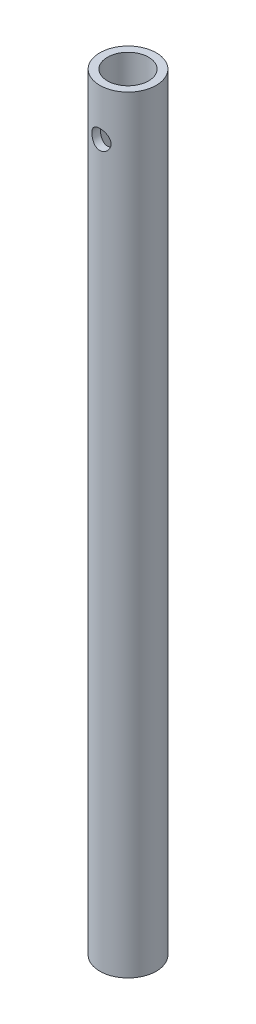
ISO-10303-21;
HEADER;
FILE_DESCRIPTION(('STEP AP214'),'2;1');
FILE_NAME('part.step','',(''),(''),'','','');
FILE_SCHEMA(('AUTOMOTIVE_DESIGN { 1 0 10303 214 1 1 1 1 }'));
ENDSEC;
DATA;
#1=APPLICATION_CONTEXT('core data for automotive mechanical design processes');
#2=APPLICATION_PROTOCOL_DEFINITION('international standard','automotive_design',2000,#1);
#3=PRODUCT_CONTEXT('',#1,'mechanical');
#4=PRODUCT('Part','Part','',(#3));
#5=PRODUCT_RELATED_PRODUCT_CATEGORY('part','',(#4));
#6=PRODUCT_DEFINITION_FORMATION('','',#4);
#7=PRODUCT_DEFINITION_CONTEXT('part definition',#1,'design');
#8=PRODUCT_DEFINITION('design','',#6,#7);
#9=PRODUCT_DEFINITION_SHAPE('','',#8);
#10=(LENGTH_UNIT() NAMED_UNIT(*) SI_UNIT(.MILLI.,.METRE.));
#11=(NAMED_UNIT(*) PLANE_ANGLE_UNIT() SI_UNIT($,.RADIAN.));
#12=(NAMED_UNIT(*) SI_UNIT($,.STERADIAN.) SOLID_ANGLE_UNIT());
#13=UNCERTAINTY_MEASURE_WITH_UNIT(LENGTH_MEASURE(1.E-05),#10,'distance_accuracy_value','');
#14=(GEOMETRIC_REPRESENTATION_CONTEXT(3) GLOBAL_UNCERTAINTY_ASSIGNED_CONTEXT((#13)) GLOBAL_UNIT_ASSIGNED_CONTEXT((#10,
#11,#12)) REPRESENTATION_CONTEXT('',''));
#15=CARTESIAN_POINT('',(0.,0.,0.));
#16=DIRECTION('',(0.,0.,1.));
#17=DIRECTION('',(1.,0.,0.));
#18=AXIS2_PLACEMENT_3D('',#15,#16,#17);
#19=CARTESIAN_POINT('',(0.,177.8,0.));
#20=DIRECTION('',(0.,-1.,0.));
#21=DIRECTION('',(0.,0.,-1.));
#22=AXIS2_PLACEMENT_3D('',#19,#20,#21);
#23=CYLINDRICAL_SURFACE('',#22,6.5405);
#24=CARTESIAN_POINT('',(0.,164.719,6.5405));
#25=CARTESIAN_POINT('',(0.121132576262376,164.718998951863,6.5405006945255));
#26=CARTESIAN_POINT('',(0.242257931020928,164.728935159981,6.53710408727894));
#27=CARTESIAN_POINT('',(0.480932900270719,164.768290105498,6.52388959711018));
#28=CARTESIAN_POINT('',(0.598482280736796,164.797710115133,6.51407129487021));
#29=CARTESIAN_POINT('',(0.826530001579762,164.874902133475,6.48907836143574));
#30=CARTESIAN_POINT('',(0.937040029700405,164.922642745856,6.47391289735371));
#31=CARTESIAN_POINT('',(1.14848359009996,165.034976223633,6.4397679194841));
#32=CARTESIAN_POINT('',(1.24941511344602,165.099572613643,6.42078760818663));
#33=CARTESIAN_POINT('',(1.4424522525712,165.246212390509,6.38024443891928));
#34=CARTESIAN_POINT('',(1.53416760658787,165.328751822334,6.35861797690676));
#35=CARTESIAN_POINT('',(1.70275505636462,165.507880393515,6.31556415375625));
#36=CARTESIAN_POINT('',(1.7796237094821,165.604472782378,6.29413683989038));
#37=CARTESIAN_POINT('',(1.91860029157389,165.812522841046,6.25320175077674));
#38=CARTESIAN_POINT('',(1.98019445121455,165.924340361728,6.23377113849206));
#39=CARTESIAN_POINT('',(2.08353522083276,166.157513847158,6.19999989694451));
#40=CARTESIAN_POINT('',(2.12528815975622,166.278866755899,6.1856576449686));
#41=CARTESIAN_POINT('',(2.18628570483226,166.523218871702,6.16435824012625));
#42=CARTESIAN_POINT('',(2.20626378011438,166.646013441285,6.15716121256191));
#43=CARTESIAN_POINT('',(2.22543766663131,166.893406446025,6.15025863403572));
#44=CARTESIAN_POINT('',(2.22464020114657,167.018004284571,6.1505506595021));
#45=CARTESIAN_POINT('',(2.20285382169742,167.259147562174,6.15838347708188));
#46=CARTESIAN_POINT('',(2.18283053398198,167.375793475745,6.16557759455485));
#47=CARTESIAN_POINT('',(2.12473928148989,167.603959589453,6.18583541439312));
#48=CARTESIAN_POINT('',(2.08666907662711,167.715479151392,6.19889984540467));
#49=CARTESIAN_POINT('',(1.99294818062452,167.932386834782,6.22966741809598));
#50=CARTESIAN_POINT('',(1.93701679186721,168.03764283422,6.2474437953798));
#51=CARTESIAN_POINT('',(1.8093561272359,168.237576837177,6.28560256000648));
#52=CARTESIAN_POINT('',(1.73762214634244,168.33225167761,6.30598572272657));
#53=CARTESIAN_POINT('',(1.5757875267895,168.513750574643,6.34841649147213));
#54=CARTESIAN_POINT('',(1.4849001028631,168.599867499244,6.37049432598464));
#55=CARTESIAN_POINT('',(1.28970379022984,168.755825725989,6.41285946846446));
#56=CARTESIAN_POINT('',(1.18539351301385,168.825665342243,6.4331465908274));
#57=CARTESIAN_POINT('',(0.964768051606887,168.947685782435,6.46992929341151));
#58=CARTESIAN_POINT('',(0.848336721616711,168.999670374811,6.48638213885732));
#59=CARTESIAN_POINT('',(0.607687892371148,169.083093586847,6.51333144827482));
#60=CARTESIAN_POINT('',(0.483473226398697,169.114539635856,6.52383006587157));
#61=CARTESIAN_POINT('',(0.236764959115406,169.154724666116,6.53732798446892));
#62=CARTESIAN_POINT('',(0.114443956022652,169.164418651597,6.54064246105451));
#63=CARTESIAN_POINT('',(-0.130105529757352,169.16355375745,6.54034816344002));
#64=CARTESIAN_POINT('',(-0.252334024955951,169.152998448899,6.53674060997882));
#65=CARTESIAN_POINT('',(-0.489361657961048,169.112686309754,6.52321577408566));
#66=CARTESIAN_POINT('',(-0.604273689019556,169.083521473034,6.51349315203944));
#67=CARTESIAN_POINT('',(-0.827522674029989,169.007564098365,6.48891124788637));
#68=CARTESIAN_POINT('',(-0.935858781739522,168.96076929721,6.47405130630871));
#69=CARTESIAN_POINT('',(-1.14612618946117,168.849491026101,6.44020082239815));
#70=CARTESIAN_POINT('',(-1.24780734719528,168.784566262349,6.4211100668744));
#71=CARTESIAN_POINT('',(-1.43913892417322,168.639386256454,6.38095542059471));
#72=CARTESIAN_POINT('',(-1.52878552806194,168.559126171955,6.35989090766877));
#73=CARTESIAN_POINT('',(-1.69792092079088,168.381065727657,6.31689668144283));
#74=CARTESIAN_POINT('',(-1.77672843460498,168.282615147222,6.29497318640828));
#75=CARTESIAN_POINT('',(-1.91679571661435,168.073420304258,6.25374947150999));
#76=CARTESIAN_POINT('',(-1.97805517100834,167.962675821933,6.23444929856076));
#77=CARTESIAN_POINT('',(-2.08104325111369,167.731882911737,6.20083441183624));
#78=CARTESIAN_POINT('',(-2.12279713219411,167.611846750713,6.18651325752495));
#79=CARTESIAN_POINT('',(-2.18529724717974,167.365843997408,6.16471679448302));
#80=CARTESIAN_POINT('',(-2.20605344066258,167.239880246387,6.15723824034612));
#81=CARTESIAN_POINT('',(-2.22517381392396,166.992827363813,6.15035238061075));
#82=CARTESIAN_POINT('',(-2.22467320716479,166.87183655478,6.15053587622403));
#83=CARTESIAN_POINT('',(-2.20410519153714,166.631760103806,6.15793612055697));
#84=CARTESIAN_POINT('',(-2.18403903623686,166.512674340304,6.1651524186837));
#85=CARTESIAN_POINT('',(-2.12572615701712,166.282228844622,6.18549477465294));
#86=CARTESIAN_POINT('',(-2.08786101954629,166.170760707029,6.19849650217168));
#87=CARTESIAN_POINT('',(-1.99533767300426,165.955676330638,6.22889459331582));
#88=CARTESIAN_POINT('',(-1.94067564659561,165.852061883385,6.24629195575329));
#89=CARTESIAN_POINT('',(-1.81324008123762,165.650566450227,6.28449753017933));
#90=CARTESIAN_POINT('',(-1.73976178987064,165.553153774604,6.30542406016515));
#91=CARTESIAN_POINT('',(-1.57795557245076,165.371675083012,6.34784873775207));
#92=CARTESIAN_POINT('',(-1.48962337120322,165.287612923119,6.36934704841694));
#93=CARTESIAN_POINT('',(-1.29625989696614,165.131732378335,6.41155393299936));
#94=CARTESIAN_POINT('',(-1.19069148380667,165.060559251742,6.43219372816793));
#95=CARTESIAN_POINT('',(-0.968401107370004,164.937039329269,6.4693906782087));
#96=CARTESIAN_POINT('',(-0.851681484872829,164.884688593273,6.48594868729819));
#97=CARTESIAN_POINT('',(-0.614188549956153,164.801971730771,6.51265898473805));
#98=CARTESIAN_POINT('',(-0.493661612595488,164.770960349893,6.52299796775736));
#99=CARTESIAN_POINT('',(-0.248753123994206,164.729478142799,6.53691709214358));
#100=CARTESIAN_POINT('',(-0.124372755493418,164.719001076174,6.54049928689662));
#101=CARTESIAN_POINT('',(0.,164.719,6.5405));
#102=B_SPLINE_CURVE_WITH_KNOTS('',3,(#24,#25,#26,#27,#28,#29,#30,#31,#32,#33,#34,#35,#36,#37,
#38,#39,#40,#41,#42,#43,#44,#45,#46,#47,#48,#49,#50,#51,#52,#53,#54,#55,#56,#57,#58,#59,#60,#61,
#62,#63,#64,#65,#66,#67,#68,#69,#70,#71,#72,#73,#74,#75,#76,#77,#78,#79,#80,#81,#82,#83,#84,#85,
#86,#87,#88,#89,#90,#91,#92,#93,#94,#95,#96,#97,#98,#99,#100,#101),.UNSPECIFIED.,.T.,.F.,(4,2,2,
2,2,2,2,2,2,2,2,2,2,2,2,2,2,2,2,2,2,2,2,2,2,2,2,2,2,2,2,2,2,2,2,2,2,2,4),(0.,0.362939878723582,
0.725903458718204,1.08824777976366,1.45066792935401,1.82479151247003,2.19900174322381,
2.58447237758201,2.96981997197505,3.34174285046678,3.71354537056326,4.0676004417078,
4.42169947169597,4.78166248781142,5.14173282350607,5.52138845459631,5.90108339027432,
6.28482691637257,6.66843155500685,7.03483448314207,7.40117280000171,7.75640188898351,
8.11167659518845,8.47649249830628,8.84142378846465,9.22362112384597,9.60582529340308,
9.98753321271865,10.3690599961541,10.730238446787,11.0913937581723,11.4451367958652,
11.7989602863432,12.1687172332681,12.5385807849226,12.9236465107206,13.3086315832049,
13.6813930529482,14.0540412223186),.UNSPECIFIED.);
#103=CARTESIAN_POINT('',(0.,164.719,6.5405));
#104=VERTEX_POINT('',#103);
#105=EDGE_CURVE('E53',#104,#104,#102,.T.);
#106=ORIENTED_EDGE('',*,*,#105,.F.);
#107=EDGE_LOOP('',(#106));
#108=FACE_BOUND('',#107,.T.);
#109=CARTESIAN_POINT('',(0.,169.164,-6.5405));
#110=CARTESIAN_POINT('',(0.121132576262376,169.164001048137,-6.5405006945255));
#111=CARTESIAN_POINT('',(0.242257931020929,169.154064840019,-6.53710408727894));
#112=CARTESIAN_POINT('',(0.48093290027072,169.114709894502,-6.52388959711018));
#113=CARTESIAN_POINT('',(0.598482280736795,169.085289884867,-6.51407129487021));
#114=CARTESIAN_POINT('',(0.82653000157977,169.008097866525,-6.48907836143574));
#115=CARTESIAN_POINT('',(0.937040029700422,168.960357254144,-6.47391289735371));
#116=CARTESIAN_POINT('',(1.14848359009997,168.848023776367,-6.4397679194841));
#117=CARTESIAN_POINT('',(1.24941511344603,168.783427386357,-6.42078760818663));
#118=CARTESIAN_POINT('',(1.4424522525712,168.636787609491,-6.38024443891927));
#119=CARTESIAN_POINT('',(1.53416760658787,168.554248177666,-6.35861797690676));
#120=CARTESIAN_POINT('',(1.70275505636462,168.375119606485,-6.31556415375625));
#121=CARTESIAN_POINT('',(1.7796237094821,168.278527217622,-6.29413683989038));
#122=CARTESIAN_POINT('',(1.91860029157389,168.070477158954,-6.25320175077674));
#123=CARTESIAN_POINT('',(1.98019445121455,167.958659638272,-6.23377113849206));
#124=CARTESIAN_POINT('',(2.08353522083276,167.725486152842,-6.19999989694451));
#125=CARTESIAN_POINT('',(2.12528815975622,167.604133244101,-6.1856576449686));
#126=CARTESIAN_POINT('',(2.18628570483226,167.359781128298,-6.16435824012625));
#127=CARTESIAN_POINT('',(2.20626378011438,167.236986558715,-6.15716121256191));
#128=CARTESIAN_POINT('',(2.22543766663131,166.989593553975,-6.15025863403572));
#129=CARTESIAN_POINT('',(2.22464020114657,166.864995715429,-6.1505506595021));
#130=CARTESIAN_POINT('',(2.20285382169742,166.623852437826,-6.15838347708188));
#131=CARTESIAN_POINT('',(2.18283053398198,166.507206524255,-6.16557759455485));
#132=CARTESIAN_POINT('',(2.12473928148989,166.279040410547,-6.18583541439312));
#133=CARTESIAN_POINT('',(2.08666907662711,166.167520848608,-6.19889984540467));
#134=CARTESIAN_POINT('',(1.99294818062452,165.950613165218,-6.22966741809598));
#135=CARTESIAN_POINT('',(1.93701679186721,165.84535716578,-6.2474437953798));
#136=CARTESIAN_POINT('',(1.8093561272359,165.645423162823,-6.28560256000648));
#137=CARTESIAN_POINT('',(1.73762214634244,165.55074832239,-6.30598572272657));
#138=CARTESIAN_POINT('',(1.5757875267895,165.369249425357,-6.34841649147213));
#139=CARTESIAN_POINT('',(1.48490010286309,165.283132500756,-6.37049432598464));
#140=CARTESIAN_POINT('',(1.28970379022983,165.127174274011,-6.41285946846446));
#141=CARTESIAN_POINT('',(1.18539351301385,165.057334657757,-6.4331465908274));
#142=CARTESIAN_POINT('',(0.964768051606888,164.935314217565,-6.46992929341151));
#143=CARTESIAN_POINT('',(0.848336721616712,164.883329625189,-6.48638213885732));
#144=CARTESIAN_POINT('',(0.607687892371147,164.799906413153,-6.51333144827482));
#145=CARTESIAN_POINT('',(0.483473226398697,164.768460364144,-6.52383006587157));
#146=CARTESIAN_POINT('',(0.236764959115407,164.728275333884,-6.53732798446892));
#147=CARTESIAN_POINT('',(0.114443956022652,164.718581348403,-6.54064246105451));
#148=CARTESIAN_POINT('',(-0.130105529757353,164.71944624255,-6.54034816344002));
#149=CARTESIAN_POINT('',(-0.252334024955953,164.730001551101,-6.53674060997882));
#150=CARTESIAN_POINT('',(-0.489361657961057,164.770313690246,-6.52321577408566));
#151=CARTESIAN_POINT('',(-0.604273689019571,164.799478526966,-6.51349315203944));
#152=CARTESIAN_POINT('',(-0.827522674030003,164.875435901635,-6.48891124788637));
#153=CARTESIAN_POINT('',(-0.935858781739531,164.92223070279,-6.47405130630871));
#154=CARTESIAN_POINT('',(-1.14612618946117,165.033508973899,-6.44020082239815));
#155=CARTESIAN_POINT('',(-1.24780734719528,165.098433737651,-6.4211100668744));
#156=CARTESIAN_POINT('',(-1.43913892417322,165.243613743546,-6.38095542059471));
#157=CARTESIAN_POINT('',(-1.52878552806194,165.323873828045,-6.35989090766877));
#158=CARTESIAN_POINT('',(-1.69792092079088,165.501934272343,-6.31689668144283));
#159=CARTESIAN_POINT('',(-1.77672843460498,165.600384852778,-6.29497318640828));
#160=CARTESIAN_POINT('',(-1.91679571661435,165.809579695742,-6.25374947150999));
#161=CARTESIAN_POINT('',(-1.97805517100834,165.920324178067,-6.23444929856076));
#162=CARTESIAN_POINT('',(-2.08104325111369,166.151117088263,-6.20083441183624));
#163=CARTESIAN_POINT('',(-2.12279713219411,166.271153249287,-6.18651325752495));
#164=CARTESIAN_POINT('',(-2.18529724717974,166.517156002592,-6.16471679448302));
#165=CARTESIAN_POINT('',(-2.20605344066258,166.643119753613,-6.15723824034612));
#166=CARTESIAN_POINT('',(-2.22517381392396,166.890172636187,-6.15035238061075));
#167=CARTESIAN_POINT('',(-2.22467320716479,167.01116344522,-6.15053587622403));
#168=CARTESIAN_POINT('',(-2.20410519153714,167.251239896194,-6.15793612055697));
#169=CARTESIAN_POINT('',(-2.18403903623686,167.370325659696,-6.1651524186837));
#170=CARTESIAN_POINT('',(-2.12572615701712,167.600771155378,-6.18549477465294));
#171=CARTESIAN_POINT('',(-2.0878610195463,167.712239292971,-6.19849650217168));
#172=CARTESIAN_POINT('',(-1.99533767300427,167.927323669362,-6.22889459331582));
#173=CARTESIAN_POINT('',(-1.94067564659562,168.030938116615,-6.24629195575329));
#174=CARTESIAN_POINT('',(-1.81324008123762,168.232433549773,-6.28449753017933));
#175=CARTESIAN_POINT('',(-1.73976178987064,168.329846225396,-6.30542406016515));
#176=CARTESIAN_POINT('',(-1.57795557245076,168.511324916988,-6.34784873775207));
#177=CARTESIAN_POINT('',(-1.48962337120321,168.595387076881,-6.36934704841694));
#178=CARTESIAN_POINT('',(-1.29625989696614,168.751267621665,-6.41155393299936));
#179=CARTESIAN_POINT('',(-1.19069148380669,168.822440748258,-6.43219372816792));
#180=CARTESIAN_POINT('',(-0.968401107370035,168.945960670731,-6.4693906782087));
#181=CARTESIAN_POINT('',(-0.851681484872857,168.998311406727,-6.48594868729819));
#182=CARTESIAN_POINT('',(-0.614188549956175,169.081028269229,-6.51265898473804));
#183=CARTESIAN_POINT('',(-0.493661612595508,169.112039650107,-6.52299796775736));
#184=CARTESIAN_POINT('',(-0.248753123994219,169.153521857201,-6.53691709214358));
#185=CARTESIAN_POINT('',(-0.124372755493425,169.163998923826,-6.54049928689662));
#186=CARTESIAN_POINT('',(0.,169.164,-6.5405));
#187=B_SPLINE_CURVE_WITH_KNOTS('',3,(#109,#110,#111,#112,#113,#114,#115,#116,#117,#118,#119,
#120,#121,#122,#123,#124,#125,#126,#127,#128,#129,#130,#131,#132,#133,#134,#135,#136,#137,#138,
#139,#140,#141,#142,#143,#144,#145,#146,#147,#148,#149,#150,#151,#152,#153,#154,#155,#156,#157,
#158,#159,#160,#161,#162,#163,#164,#165,#166,#167,#168,#169,#170,#171,#172,#173,#174,#175,#176,
#177,#178,#179,#180,#181,#182,#183,#184,#185,#186),.UNSPECIFIED.,.T.,.F.,(4,2,2,2,2,2,2,2,2,2,2,
2,2,2,2,2,2,2,2,2,2,2,2,2,2,2,2,2,2,2,2,2,2,2,2,2,2,2,4),(0.,0.362939878723583,
0.725903458718204,1.08824777976368,1.45066792935401,1.82479151247004,2.19900174322382,
2.58447237758201,2.96981997197505,3.34174285046678,3.71354537056327,4.0676004417078,
4.42169947169598,4.78166248781143,5.14173282350607,5.52138845459632,5.90108339027432,
6.28482691637258,6.66843155500685,7.03483448314207,7.40117280000172,7.75640188898354,
8.11167659518845,8.47649249830628,8.84142378846466,9.22362112384597,9.60582529340308,
9.98753321271865,10.3690599961541,10.730238446787,11.0913937581723,11.4451367958652,
11.7989602863432,12.1687172332681,12.5385807849226,12.9236465107206,13.3086315832048,
13.6813930529481,14.0540412223186),.UNSPECIFIED.);
#188=CARTESIAN_POINT('',(0.,169.164,-6.5405));
#189=VERTEX_POINT('',#188);
#190=EDGE_CURVE('E57',#189,#189,#187,.T.);
#191=ORIENTED_EDGE('',*,*,#190,.F.);
#192=EDGE_LOOP('',(#191));
#193=FACE_BOUND('',#192,.T.);
#194=CARTESIAN_POINT('',(0.,177.8,0.));
#195=DIRECTION('',(0.,-1.,0.));
#196=DIRECTION('',(1.,0.,0.));
#197=AXIS2_PLACEMENT_3D('',#194,#195,#196);
#198=CIRCLE('',#197,6.5405);
#199=CARTESIAN_POINT('',(6.5405,177.8,0.));
#200=VERTEX_POINT('',#199);
#201=EDGE_CURVE('E8',#200,#200,#198,.T.);
#202=ORIENTED_EDGE('',*,*,#201,.T.);
#203=EDGE_LOOP('',(#202));
#204=FACE_BOUND('',#203,.T.);
#205=CARTESIAN_POINT('',(0.,0.,0.));
#206=DIRECTION('',(0.,-1.,0.));
#207=DIRECTION('',(1.,0.,0.));
#208=AXIS2_PLACEMENT_3D('',#205,#206,#207);
#209=CIRCLE('',#208,6.5405);
#210=CARTESIAN_POINT('',(6.5405,0.,0.));
#211=VERTEX_POINT('',#210);
#212=EDGE_CURVE('E25',#211,#211,#209,.T.);
#213=ORIENTED_EDGE('',*,*,#212,.F.);
#214=EDGE_LOOP('',(#213));
#215=FACE_BOUND('',#214,.T.);
#216=ADVANCED_FACE('F13',(#108,#193,#204,#215),#23,.T.);
#217=CARTESIAN_POINT('',(0.,177.8,0.));
#218=DIRECTION('',(0.,-1.,0.));
#219=DIRECTION('',(0.,0.,-1.));
#220=AXIS2_PLACEMENT_3D('',#217,#218,#219);
#221=PLANE('',#220);
#222=CARTESIAN_POINT('',(0.,177.8,0.));
#223=DIRECTION('',(0.,-1.,0.));
#224=DIRECTION('',(0.,0.,-1.));
#225=AXIS2_PLACEMENT_3D('',#222,#223,#224);
#226=CIRCLE('',#225,4.766945);
#227=CARTESIAN_POINT('',(0.,177.8,-4.766945));
#228=VERTEX_POINT('',#227);
#229=EDGE_CURVE('E31',#228,#228,#226,.T.);
#230=ORIENTED_EDGE('',*,*,#229,.T.);
#231=EDGE_LOOP('',(#230));
#232=FACE_BOUND('',#231,.T.);
#233=ORIENTED_EDGE('',*,*,#201,.F.);
#234=EDGE_LOOP('',(#233));
#235=FACE_BOUND('',#234,.T.);
#236=ADVANCED_FACE('F71',(#232,#235),#221,.F.);
#237=CARTESIAN_POINT('',(0.,0.,0.));
#238=DIRECTION('',(0.,-1.,0.));
#239=DIRECTION('',(0.,0.,-1.));
#240=AXIS2_PLACEMENT_3D('',#237,#238,#239);
#241=PLANE('',#240);
#242=CARTESIAN_POINT('',(0.,0.,0.));
#243=DIRECTION('',(0.,-1.,0.));
#244=DIRECTION('',(0.,0.,-1.));
#245=AXIS2_PLACEMENT_3D('',#242,#243,#244);
#246=CIRCLE('',#245,4.766945);
#247=CARTESIAN_POINT('',(0.,0.,-4.766945));
#248=VERTEX_POINT('',#247);
#249=EDGE_CURVE('E34',#248,#248,#246,.T.);
#250=ORIENTED_EDGE('',*,*,#249,.F.);
#251=EDGE_LOOP('',(#250));
#252=FACE_BOUND('',#251,.T.);
#253=ORIENTED_EDGE('',*,*,#212,.T.);
#254=EDGE_LOOP('',(#253));
#255=FACE_BOUND('',#254,.T.);
#256=ADVANCED_FACE('F68',(#252,#255),#241,.T.);
#257=CARTESIAN_POINT('',(0.,177.8,0.));
#258=DIRECTION('',(0.,-1.,0.));
#259=DIRECTION('',(0.,0.,-1.));
#260=AXIS2_PLACEMENT_3D('',#257,#258,#259);
#261=CYLINDRICAL_SURFACE('',#260,4.766945);
#262=CARTESIAN_POINT('',(0.,169.164,-4.766945));
#263=CARTESIAN_POINT('',(0.117766059216939,169.163993585323,-4.76693961584311));
#264=CARTESIAN_POINT('',(0.23569981000505,169.154584548573,-4.76253285997614));
#265=CARTESIAN_POINT('',(0.468139745062156,169.117337311239,-4.74534117548248));
#266=CARTESIAN_POINT('',(0.582637732655629,169.089458215186,-4.73253765580283));
#267=CARTESIAN_POINT('',(0.804479408047879,169.016565730358,-4.69990448456745));
#268=CARTESIAN_POINT('',(0.911847859576572,168.971615736201,-4.68010084732036));
#269=CARTESIAN_POINT('',(1.11738753995971,168.866157163586,-4.63533055549668));
#270=CARTESIAN_POINT('',(1.21556031782195,168.805651211977,-4.61036477276235));
#271=CARTESIAN_POINT('',(1.40596212746841,168.667012327053,-4.55602527376838));
#272=CARTESIAN_POINT('',(1.49757337273357,168.588096948972,-4.52648525191303));
#273=CARTESIAN_POINT('',(1.66681544223117,168.416548201243,-4.46694023455938));
#274=CARTESIAN_POINT('',(1.74443708004963,168.323905889886,-4.43693494748105));
#275=CARTESIAN_POINT('',(1.88853242125926,168.120269307009,-4.37763344719541));
#276=CARTESIAN_POINT('',(1.95395213272345,168.008473149171,-4.34851040542571));
#277=CARTESIAN_POINT('',(2.0647879234645,167.77393554668,-4.29699633832647));
#278=CARTESIAN_POINT('',(2.11021675156752,167.651201137937,-4.27460102540949));
#279=CARTESIAN_POINT('',(2.1770789560354,167.405329826727,-4.24092341964544));
#280=CARTESIAN_POINT('',(2.19970942255286,167.282597231,-4.2290909364787));
#281=CARTESIAN_POINT('',(2.22403779947969,167.034552003204,-4.21635274719695));
#282=CARTESIAN_POINT('',(2.22575197980683,166.909241452437,-4.21543854821001));
#283=CARTESIAN_POINT('',(2.20908560808381,166.673105226773,-4.22418711698959));
#284=CARTESIAN_POINT('',(2.19270875911164,166.562090301208,-4.23279534592485));
#285=CARTESIAN_POINT('',(2.14374984941589,166.344614795012,-4.25779858491159));
#286=CARTESIAN_POINT('',(2.11116363519133,166.238155389287,-4.27419559071703));
#287=CARTESIAN_POINT('',(2.03007261746397,166.02985414632,-4.31330819121461));
#288=CARTESIAN_POINT('',(1.98121818007365,165.928175321734,-4.3361607266942));
#289=CARTESIAN_POINT('',(1.86923397603201,165.734004288433,-4.38559808223476));
#290=CARTESIAN_POINT('',(1.80609797480542,165.641516117326,-4.41218453039699));
#291=CARTESIAN_POINT('',(1.65934336929294,165.457801706061,-4.4695854481623));
#292=CARTESIAN_POINT('',(1.57424668053309,165.367797961432,-4.50054590781513));
#293=CARTESIAN_POINT('',(1.38995379369678,165.202870450162,-4.56083224801712));
#294=CARTESIAN_POINT('',(1.29075247619788,165.127952182914,-4.59015752965725));
#295=CARTESIAN_POINT('',(1.07654576424381,164.992875225011,-4.64515356973224));
#296=CARTESIAN_POINT('',(0.961104435237177,164.933334704892,-4.67065769545571));
#297=CARTESIAN_POINT('',(0.720349710320349,164.834967615268,-4.71378531148208));
#298=CARTESIAN_POINT('',(0.59504323244868,164.796126675877,-4.73141426743878));
#299=CARTESIAN_POINT('',(0.348218493622792,164.743098618799,-4.75570374469046));
#300=CARTESIAN_POINT('',(0.227122669772608,164.727278809028,-4.76308867995543));
#301=CARTESIAN_POINT('',(-0.0162127616202678,164.715727720023,-4.76846814771505));
#302=CARTESIAN_POINT('',(-0.138451908109608,164.719988664473,-4.76646631525725));
#303=CARTESIAN_POINT('',(-0.372147545233018,164.747428234954,-4.75374405088335));
#304=CARTESIAN_POINT('',(-0.483786798393448,164.769352968477,-4.74360166342596));
#305=CARTESIAN_POINT('',(-0.701620785532349,164.82962627279,-4.71630676079859));
#306=CARTESIAN_POINT('',(-0.807814880067564,164.86797676759,-4.69915342442159));
#307=CARTESIAN_POINT('',(-1.01546585910414,164.961175120449,-4.65876924211633));
#308=CARTESIAN_POINT('',(-1.1166776530207,165.016492763864,-4.63536817488875));
#309=CARTESIAN_POINT('',(-1.30874111778113,165.14154162586,-4.58484886878455));
#310=CARTESIAN_POINT('',(-1.3995882086543,165.211279178346,-4.55772899820294));
#311=CARTESIAN_POINT('',(-1.57676049847797,165.370285827635,-4.49966953148111));
#312=CARTESIAN_POINT('',(-1.66199093422751,165.460731277072,-4.46860350756727));
#313=CARTESIAN_POINT('',(-1.81648181791196,165.654913971615,-4.40806737072704));
#314=CARTESIAN_POINT('',(-1.88573468205025,165.758657492494,-4.37859802072308));
#315=CARTESIAN_POINT('',(-2.00830553538697,165.980866076696,-4.32378755704017));
#316=CARTESIAN_POINT('',(-2.06103781676141,166.099697923725,-4.29861016417268));
#317=CARTESIAN_POINT('',(-2.14520976737692,166.346115118932,-4.25723811096668));
#318=CARTESIAN_POINT('',(-2.17667294209268,166.473690631712,-4.24103353794518));
#319=CARTESIAN_POINT('',(-2.21482492984634,166.72162462763,-4.22122437371293));
#320=CARTESIAN_POINT('',(-2.2234894717661,166.841598549742,-4.21661659122599));
#321=CARTESIAN_POINT('',(-2.22133141699499,167.081304749409,-4.21775509823733));
#322=CARTESIAN_POINT('',(-2.21051426372263,167.201037085108,-4.22349849549259));
#323=CARTESIAN_POINT('',(-2.17147918966888,167.427771372765,-4.24368514284248));
#324=CARTESIAN_POINT('',(-2.14458224279941,167.535066307222,-4.25746617808421));
#325=CARTESIAN_POINT('',(-2.07563364436149,167.743570776804,-4.29150080013344));
#326=CARTESIAN_POINT('',(-2.03357748173618,167.844778490031,-4.31175631340313));
#327=CARTESIAN_POINT('',(-1.93234067468525,168.045600559636,-4.35810890688144));
#328=CARTESIAN_POINT('',(-1.87221061957379,168.144665797076,-4.38450395174044));
#329=CARTESIAN_POINT('',(-1.73769219538827,168.331908315457,-4.43953481719271));
#330=CARTESIAN_POINT('',(-1.6632971817721,168.420080490872,-4.46817167831936));
#331=CARTESIAN_POINT('',(-1.49358594200558,168.59217588718,-4.527895164389));
#332=CARTESIAN_POINT('',(-1.39692099686645,168.674790503664,-4.5589400993399));
#333=CARTESIAN_POINT('',(-1.19008288178123,168.822823711493,-4.61725025756585));
#334=CARTESIAN_POINT('',(-1.07990332932968,168.888234131654,-4.64451368190628));
#335=CARTESIAN_POINT('',(-0.849345726077957,168.999266280155,-4.69213759403886));
#336=CARTESIAN_POINT('',(-0.72902680627517,169.04499437668,-4.71253505325859));
#337=CARTESIAN_POINT('',(-0.481373834244925,169.115032132292,-4.74420801136511));
#338=CARTESIAN_POINT('',(-0.354061884530909,169.139405564753,-4.75551066259734));
#339=CARTESIAN_POINT('',(-0.188124418907601,169.156346233859,-4.76338112041965));
#340=CARTESIAN_POINT('',(-0.150574698634944,169.159213282125,-4.7647149043042));
#341=CARTESIAN_POINT('',(-0.0753557114106409,169.163041210444,-4.76649771434533));
#342=CARTESIAN_POINT('',(-0.037686442107572,169.164002052768,-4.76694672298979));
#343=CARTESIAN_POINT('',(0.,169.164,-4.766945));
#344=B_SPLINE_CURVE_WITH_KNOTS('',3,(#262,#263,#264,#265,#266,#267,#268,#269,#270,#271,#272,
#273,#274,#275,#276,#277,#278,#279,#280,#281,#282,#283,#284,#285,#286,#287,#288,#289,#290,#291,
#292,#293,#294,#295,#296,#297,#298,#299,#300,#301,#302,#303,#304,#305,#306,#307,#308,#309,#310,
#311,#312,#313,#314,#315,#316,#317,#318,#319,#320,#321,#322,#323,#324,#325,#326,#327,#328,#329,
#330,#331,#332,#333,#334,#335,#336,#337,#338,#339,#340,#341,#342,#343),.UNSPECIFIED.,.T.,.F.,(4,
2,2,2,2,2,2,2,2,2,2,2,2,2,2,2,2,2,2,2,2,2,2,2,2,2,2,2,2,2,2,2,2,2,2,2,2,2,2,2,4),(0.,
0.353144127731603,0.707072794285898,1.05969976122809,1.41226722106276,1.78409732793206,
2.15617071809675,2.55245383248962,2.94848385690243,3.32242392304206,3.69607309804229,
4.03214222594283,4.36829751286516,4.71220172809043,5.05625636443475,5.43758899517608,
5.81906038959605,6.21407002521643,6.60880508224797,6.97389022226343,7.33883399389156,
7.67993946284776,8.02108489765213,8.37269050337098,8.72445088022738,9.10705138911852,
9.48983312844276,9.88495546602553,10.2796404185969,10.6387853838845,10.997830015344,
11.3307954483418,11.6638600466089,12.0189757866812,12.3742573413793,12.7650993024037,
13.156126561122,13.5450132364129,13.9327345462223,14.0457423381551,14.158752366799),.UNSPECIFIED.);
#345=CARTESIAN_POINT('',(0.,169.164,-4.766945));
#346=VERTEX_POINT('',#345);
#347=EDGE_CURVE('E17',#346,#346,#344,.T.);
#348=ORIENTED_EDGE('',*,*,#347,.T.);
#349=EDGE_LOOP('',(#348));
#350=FACE_BOUND('',#349,.T.);
#351=CARTESIAN_POINT('',(-2.2225,166.9415,4.21713864877893));
#352=CARTESIAN_POINT('',(-2.22249221071249,166.824522790713,4.21714748996118));
#353=CARTESIAN_POINT('',(-2.21320407288086,166.707367671409,4.22207826599312));
#354=CARTESIAN_POINT('',(-2.17648001936089,166.476562353023,4.24112041904951));
#355=CARTESIAN_POINT('',(-2.14900100014688,166.362921151283,4.25525359998048));
#356=CARTESIAN_POINT('',(-2.07727556340326,166.142903581001,4.29071885055137));
#357=CARTESIAN_POINT('',(-2.033109276304,166.036495317468,4.31201646460029));
#358=CARTESIAN_POINT('',(-1.9295050945824,165.832624758996,4.35935862314548));
#359=CARTESIAN_POINT('',(-1.8700681859533,165.735161887021,4.38540286113026));
#360=CARTESIAN_POINT('',(-1.73263508810351,165.544259962839,4.44157919735537));
#361=CARTESIAN_POINT('',(-1.65361856266259,165.451601891932,4.47187033006825));
#362=CARTESIAN_POINT('',(-1.4814000211677,165.280258078645,4.53183540759364));
#363=CARTESIAN_POINT('',(-1.38819170419833,165.201578576302,4.56150907157571));
#364=CARTESIAN_POINT('',(-1.18375811036197,165.056073754207,4.61891384754067));
#365=CARTESIAN_POINT('',(-1.07181058143268,164.990174475565,4.64643917322845));
#366=CARTESIAN_POINT('',(-0.836897382935254,164.878493832286,4.69443297447824));
#367=CARTESIAN_POINT('',(-0.713937825748623,164.832701389374,4.71490533467392));
#368=CARTESIAN_POINT('',(-0.468735064795984,164.765514042069,4.74534880266509));
#369=CARTESIAN_POINT('',(-0.346938298697339,164.742759390002,4.75590212819935));
#370=CARTESIAN_POINT('',(-0.100831172663723,164.717851264809,4.76746707929947));
#371=CARTESIAN_POINT('',(0.0234778545715255,164.715687142148,4.76848363733044));
#372=CARTESIAN_POINT('',(0.261003504417941,164.73141602024,4.76116546729625));
#373=CARTESIAN_POINT('',(0.374346274638153,164.74780005302,4.7535342258136));
#374=CARTESIAN_POINT('',(0.596456300096647,164.797508468615,4.73080027348957));
#375=CARTESIAN_POINT('',(0.705223214903375,164.830834109435,4.71569700781215));
#376=CARTESIAN_POINT('',(0.917090903497641,164.913793630214,4.67915042708882));
#377=CARTESIAN_POINT('',(1.02008289060623,164.963663471846,4.65761585703609));
#378=CARTESIAN_POINT('',(1.21650247281593,165.078020227577,4.61021800292963));
#379=CARTESIAN_POINT('',(1.3099265423969,165.142512501719,4.58435313245991));
#380=CARTESIAN_POINT('',(1.49300980981269,165.290608559527,4.52820233572202));
#381=CARTESIAN_POINT('',(1.58167553701864,165.375370228701,4.49772749543235));
#382=CARTESIAN_POINT('',(1.74402811132791,165.558440008673,4.43730209635998));
#383=CARTESIAN_POINT('',(1.81770600879064,165.65675615478,4.4073518605298));
#384=CARTESIAN_POINT('',(1.95151367123399,165.870178459765,4.34981976398473));
#385=CARTESIAN_POINT('',(2.01079123169616,165.985875177861,4.32242879025202));
#386=CARTESIAN_POINT('',(2.10860114698423,166.227205215021,4.27557475259162));
#387=CARTESIAN_POINT('',(2.14715252116827,166.352829302385,4.25610442430071));
#388=CARTESIAN_POINT('',(2.19955146483184,166.600500754184,4.22924922498036));
#389=CARTESIAN_POINT('',(2.2150288158376,166.722114684951,4.22107044538038));
#390=CARTESIAN_POINT('',(2.22571665176968,166.966450977627,4.21544768775431));
#391=CARTESIAN_POINT('',(2.22093771992111,167.089172727302,4.21799810407972));
#392=CARTESIAN_POINT('',(2.19274285007009,167.320668805338,4.23271133490683));
#393=CARTESIAN_POINT('',(2.17102126487198,167.429713263036,4.24399957777767));
#394=CARTESIAN_POINT('',(2.11195679374072,167.642456175277,4.27369714659305));
#395=CARTESIAN_POINT('',(2.07460956257873,167.746153133753,4.29210845323428));
#396=CARTESIAN_POINT('',(1.98349824447451,167.950630726968,4.33498975539452));
#397=CARTESIAN_POINT('',(1.92905851927306,168.051058277581,4.3596993206569));
#398=CARTESIAN_POINT('',(1.80592741055814,168.241901289744,4.41212709308235));
#399=CARTESIAN_POINT('',(1.73722899323198,168.332311775987,4.43984678190929));
#400=CARTESIAN_POINT('',(1.57894430156875,168.510614563384,4.49872824894582));
#401=CARTESIAN_POINT('',(1.48791229205589,168.597211919707,4.52994205900332));
#402=CARTESIAN_POINT('',(1.29199795654328,168.754234996358,4.58966086778418));
#403=CARTESIAN_POINT('',(1.18711275136597,168.8246573466,4.61816530128094));
#404=CARTESIAN_POINT('',(0.964178680293562,168.948069273777,4.66983803058612));
#405=CARTESIAN_POINT('',(0.845960608516806,169.000790528216,4.69292272485163));
#406=CARTESIAN_POINT('',(0.600955162961447,169.08512034365,4.73053170310747));
#407=CARTESIAN_POINT('',(0.474174389514859,169.116744966427,4.74506249855951));
#408=CARTESIAN_POINT('',(0.227057077448842,169.155607640237,4.76301019479822));
#409=CARTESIAN_POINT('',(0.107064523515439,169.164659047677,4.76725268962634));
#410=CARTESIAN_POINT('',(-0.132766618934442,169.16326664438,4.76660266600779));
#411=CARTESIAN_POINT('',(-0.252605239840237,169.152828002467,4.76171256955377));
#412=CARTESIAN_POINT('',(-0.48218786151067,169.114022071038,4.74382124094687));
#413=CARTESIAN_POINT('',(-0.592132209214663,169.086619502807,4.73125691716168));
#414=CARTESIAN_POINT('',(-0.80574337144298,169.015855448342,4.69959682981088));
#415=CARTESIAN_POINT('',(-0.909409160799717,168.972491364037,4.68050000297944));
#416=CARTESIAN_POINT('',(-1.1127539399207,168.868905706863,4.63647036370492));
#417=CARTESIAN_POINT('',(-1.21203861662035,168.808008530982,4.61131206919394));
#418=CARTESIAN_POINT('',(-1.39941457018765,168.671981497704,4.55795021306221));
#419=CARTESIAN_POINT('',(-1.48750078773008,168.596845245178,4.52974528557908));
#420=CARTESIAN_POINT('',(-1.65803060506992,168.42681661976,4.47029625676932));
#421=CARTESIAN_POINT('',(-1.73931346675399,168.330773183227,4.4390015075996));
#422=CARTESIAN_POINT('',(-1.88492665692658,168.125728041865,4.37915828206618));
#423=CARTESIAN_POINT('',(-1.94924500927491,168.016717261061,4.35061175479664));
#424=CARTESIAN_POINT('',(-2.05961188394461,167.78646313174,4.29948226427858));
#425=CARTESIAN_POINT('',(-2.10540736519313,167.665076992473,4.27698322025486));
#426=CARTESIAN_POINT('',(-2.15781542501063,167.477740500505,4.25064272300858));
#427=CARTESIAN_POINT('',(-2.1725644480142,167.414479707305,4.2431007968392));
#428=CARTESIAN_POINT('',(-2.19649315322651,167.286664957874,4.23076456703712));
#429=CARTESIAN_POINT('',(-2.2056769078868,167.222111983035,4.22596825441157));
#430=CARTESIAN_POINT('',(-2.2154987926474,167.12141062047,4.22082264874105));
#431=CARTESIAN_POINT('',(-2.2181221651759,167.085494778236,4.21944372112974));
#432=CARTESIAN_POINT('',(-2.22162400851706,167.013558255577,4.21760033840853));
#433=CARTESIAN_POINT('',(-2.22250239967254,166.977537570441,4.21713592504557));
#434=CARTESIAN_POINT('',(-2.2225,166.9415,4.21713864877893));
#435=B_SPLINE_CURVE_WITH_KNOTS('',3,(#351,#352,#353,#354,#355,#356,#357,#358,#359,#360,#361,
#362,#363,#364,#365,#366,#367,#368,#369,#370,#371,#372,#373,#374,#375,#376,#377,#378,#379,#380,
#381,#382,#383,#384,#385,#386,#387,#388,#389,#390,#391,#392,#393,#394,#395,#396,#397,#398,#399,
#400,#401,#402,#403,#404,#405,#406,#407,#408,#409,#410,#411,#412,#413,#414,#415,#416,#417,#418,
#419,#420,#421,#422,#423,#424,#425,#426,#427,#428,#429,#430,#431,#432,#433,#434),.UNSPECIFIED.,
.T.,.F.,(4,2,2,2,2,2,2,2,2,2,2,2,2,2,2,2,2,2,2,2,2,2,2,2,2,2,2,2,2,2,2,2,2,2,2,2,2,2,2,2,2,4),
(0.,0.350786913022609,0.702408009595162,1.05236168756504,1.40229277540761,1.77714683592031,
2.15216781323072,2.54846985954041,2.94455328025609,3.31558870594055,3.68643221961168,
4.02914563922196,4.37188451087829,4.71973841725814,5.0677200407398,5.44525295118739,
5.82301063930624,6.21948622804505,6.61559736776884,6.98212888550772,7.3484689264929,
7.68224596148415,8.01611587600086,8.3653306814331,8.7147181657112,9.1013362667605,
9.48803484735774,9.88035526841724,10.2723766569609,10.6317140602239,10.9909561795821,
11.3314382621952,11.6719757899195,12.0279645853595,12.3841136448604,12.7713003886345,
13.158759740727,13.5513466039024,13.7472780196596,13.9430658865852,14.051129082214,
14.1591972107388),.UNSPECIFIED.);
#436=CARTESIAN_POINT('',(-2.2225,166.9415,4.21713864877893));
#437=VERTEX_POINT('',#436);
#438=EDGE_CURVE('E36',#437,#437,#435,.T.);
#439=ORIENTED_EDGE('',*,*,#438,.T.);
#440=EDGE_LOOP('',(#439));
#441=FACE_BOUND('',#440,.T.);
#442=ORIENTED_EDGE('',*,*,#229,.F.);
#443=EDGE_LOOP('',(#442));
#444=FACE_BOUND('',#443,.T.);
#445=ORIENTED_EDGE('',*,*,#249,.T.);
#446=EDGE_LOOP('',(#445));
#447=FACE_BOUND('',#446,.T.);
#448=ADVANCED_FACE('F40',(#350,#441,#444,#447),#261,.F.);
#449=CARTESIAN_POINT('',(0.,166.9415,6.5405));
#450=DIRECTION('',(0.,0.,-1.));
#451=DIRECTION('',(-1.,0.,0.));
#452=AXIS2_PLACEMENT_3D('',#449,#450,#451);
#453=CYLINDRICAL_SURFACE('',#452,2.2225);
#454=ORIENTED_EDGE('',*,*,#105,.T.);
#455=EDGE_LOOP('',(#454));
#456=FACE_BOUND('',#455,.T.);
#457=ORIENTED_EDGE('',*,*,#438,.F.);
#458=EDGE_LOOP('',(#457));
#459=FACE_BOUND('',#458,.T.);
#460=ADVANCED_FACE('F46',(#456,#459),#453,.F.);
#461=ORIENTED_EDGE('',*,*,#190,.T.);
#462=EDGE_LOOP('',(#461));
#463=FACE_BOUND('',#462,.T.);
#464=ORIENTED_EDGE('',*,*,#347,.F.);
#465=EDGE_LOOP('',(#464));
#466=FACE_BOUND('',#465,.T.);
#467=ADVANCED_FACE('F43',(#463,#466),#453,.F.);
#468=CLOSED_SHELL('',(#216,#236,#256,#448,#460,#467));
#469=MANIFOLD_SOLID_BREP('B1',#468);
#470=ADVANCED_BREP_SHAPE_REPRESENTATION('',(#18,#469),#14);
#471=SHAPE_DEFINITION_REPRESENTATION(#9,#470);
ENDSEC;
END-ISO-10303-21;
